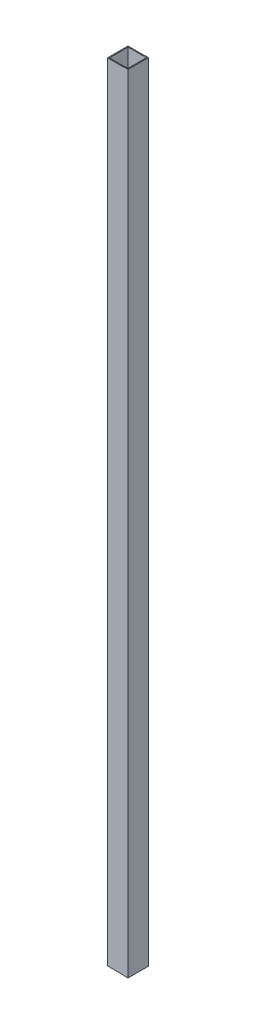
ISO-10303-21;
HEADER;
FILE_DESCRIPTION(('STEP AP214'),'2;1');
FILE_NAME('part.step','',(''),(''),'','','');
FILE_SCHEMA(('AUTOMOTIVE_DESIGN { 1 0 10303 214 1 1 1 1 }'));
ENDSEC;
DATA;
#1=APPLICATION_CONTEXT('core data for automotive mechanical design processes');
#2=APPLICATION_PROTOCOL_DEFINITION('international standard','automotive_design',2000,#1);
#3=PRODUCT_CONTEXT('',#1,'mechanical');
#4=PRODUCT('Part','Part','',(#3));
#5=PRODUCT_RELATED_PRODUCT_CATEGORY('part','',(#4));
#6=PRODUCT_DEFINITION_FORMATION('','',#4);
#7=PRODUCT_DEFINITION_CONTEXT('part definition',#1,'design');
#8=PRODUCT_DEFINITION('design','',#6,#7);
#9=PRODUCT_DEFINITION_SHAPE('','',#8);
#10=(LENGTH_UNIT() NAMED_UNIT(*) SI_UNIT(.MILLI.,.METRE.));
#11=(NAMED_UNIT(*) PLANE_ANGLE_UNIT() SI_UNIT($,.RADIAN.));
#12=(NAMED_UNIT(*) SI_UNIT($,.STERADIAN.) SOLID_ANGLE_UNIT());
#13=UNCERTAINTY_MEASURE_WITH_UNIT(LENGTH_MEASURE(1.E-05),#10,'distance_accuracy_value','');
#14=(GEOMETRIC_REPRESENTATION_CONTEXT(3) GLOBAL_UNCERTAINTY_ASSIGNED_CONTEXT((#13)) GLOBAL_UNIT_ASSIGNED_CONTEXT((#10,
#11,#12)) REPRESENTATION_CONTEXT('',''));
#15=CARTESIAN_POINT('',(0.,0.,0.));
#16=DIRECTION('',(0.,0.,1.));
#17=DIRECTION('',(1.,0.,0.));
#18=AXIS2_PLACEMENT_3D('',#15,#16,#17);
#19=CARTESIAN_POINT('',(0.,1923.,0.));
#20=DIRECTION('',(0.,-1.,0.));
#21=DIRECTION('',(0.,0.,-1.));
#22=AXIS2_PLACEMENT_3D('',#19,#20,#21);
#23=PLANE('',#22);
#24=DIRECTION('',(-1.,0.,0.));
#25=VECTOR('',#24,1.);
#26=CARTESIAN_POINT('',(0.,1923.,-50.));
#27=LINE('',#26,#25);
#28=CARTESIAN_POINT('',(50.,1923.,-50.));
#29=VERTEX_POINT('',#28);
#30=CARTESIAN_POINT('',(40.,1923.,-50.));
#31=VERTEX_POINT('',#30);
#32=EDGE_CURVE('E184',#29,#31,#27,.T.);
#33=ORIENTED_EDGE('',*,*,#32,.T.);
#34=DIRECTION('',(0.,0.,1.));
#35=VECTOR('',#34,1.);
#36=CARTESIAN_POINT('',(40.,1923.,-50.));
#37=LINE('',#36,#35);
#38=CARTESIAN_POINT('',(40.,1923.,-47.8));
#39=VERTEX_POINT('',#38);
#40=EDGE_CURVE('E257',#31,#39,#37,.T.);
#41=ORIENTED_EDGE('',*,*,#40,.T.);
#42=DIRECTION('',(-1.,0.,0.));
#43=VECTOR('',#42,1.);
#44=CARTESIAN_POINT('',(2.2,1923.,-47.8));
#45=LINE('',#44,#43);
#46=CARTESIAN_POINT('',(47.8,1923.,-47.8));
#47=VERTEX_POINT('',#46);
#48=EDGE_CURVE('E208',#47,#39,#45,.T.);
#49=ORIENTED_EDGE('',*,*,#48,.F.);
#50=DIRECTION('',(0.,0.,-1.));
#51=VECTOR('',#50,1.);
#52=CARTESIAN_POINT('',(47.8,1923.,-47.8));
#53=LINE('',#52,#51);
#54=CARTESIAN_POINT('',(47.8,1923.,-2.2));
#55=VERTEX_POINT('',#54);
#56=EDGE_CURVE('E213',#55,#47,#53,.T.);
#57=ORIENTED_EDGE('',*,*,#56,.F.);
#58=DIRECTION('',(1.,0.,0.));
#59=VECTOR('',#58,1.);
#60=CARTESIAN_POINT('',(47.8,1923.,-2.2));
#61=LINE('',#60,#59);
#62=CARTESIAN_POINT('',(40.,1923.,-2.2));
#63=VERTEX_POINT('',#62);
#64=EDGE_CURVE('E277',#63,#55,#61,.T.);
#65=ORIENTED_EDGE('',*,*,#64,.F.);
#66=CARTESIAN_POINT('',(40.,1923.,0.));
#67=VERTEX_POINT('',#66);
#68=EDGE_CURVE('E241',#63,#67,#37,.T.);
#69=ORIENTED_EDGE('',*,*,#68,.T.);
#70=DIRECTION('',(1.,0.,0.));
#71=VECTOR('',#70,1.);
#72=CARTESIAN_POINT('',(50.,1923.,0.));
#73=LINE('',#72,#71);
#74=CARTESIAN_POINT('',(50.,1923.,0.));
#75=VERTEX_POINT('',#74);
#76=EDGE_CURVE('E171',#67,#75,#73,.T.);
#77=ORIENTED_EDGE('',*,*,#76,.T.);
#78=DIRECTION('',(0.,0.,-1.));
#79=VECTOR('',#78,1.);
#80=CARTESIAN_POINT('',(50.,1923.,-50.));
#81=LINE('',#80,#79);
#82=EDGE_CURVE('E174',#75,#29,#81,.T.);
#83=ORIENTED_EDGE('',*,*,#82,.T.);
#84=EDGE_LOOP('',(#33,#41,#49,#57,#65,#69,#77,#83));
#85=FACE_BOUND('',#84,.T.);
#86=ADVANCED_FACE('F33',(#85),#23,.F.);
#87=CARTESIAN_POINT('',(0.,0.,0.));
#88=DIRECTION('',(0.,-1.,0.));
#89=DIRECTION('',(0.,0.,-1.));
#90=AXIS2_PLACEMENT_3D('',#87,#88,#89);
#91=PLANE('',#90);
#92=DIRECTION('',(0.,0.,1.));
#93=VECTOR('',#92,1.);
#94=CARTESIAN_POINT('',(40.,0.,-50.));
#95=LINE('',#94,#93);
#96=CARTESIAN_POINT('',(40.,0.,-50.));
#97=VERTEX_POINT('',#96);
#98=CARTESIAN_POINT('',(40.,0.,-47.8));
#99=VERTEX_POINT('',#98);
#100=EDGE_CURVE('E56',#97,#99,#95,.T.);
#101=ORIENTED_EDGE('',*,*,#100,.F.);
#102=DIRECTION('',(-1.,0.,0.));
#103=VECTOR('',#102,1.);
#104=CARTESIAN_POINT('',(0.,0.,-50.));
#105=LINE('',#104,#103);
#106=CARTESIAN_POINT('',(50.,0.,-50.));
#107=VERTEX_POINT('',#106);
#108=EDGE_CURVE('E159',#107,#97,#105,.T.);
#109=ORIENTED_EDGE('',*,*,#108,.F.);
#110=DIRECTION('',(0.,0.,-1.));
#111=VECTOR('',#110,1.);
#112=CARTESIAN_POINT('',(50.,0.,-50.));
#113=LINE('',#112,#111);
#114=CARTESIAN_POINT('',(50.,0.,0.));
#115=VERTEX_POINT('',#114);
#116=EDGE_CURVE('E172',#115,#107,#113,.T.);
#117=ORIENTED_EDGE('',*,*,#116,.F.);
#118=DIRECTION('',(1.,0.,0.));
#119=VECTOR('',#118,1.);
#120=CARTESIAN_POINT('',(50.,0.,0.));
#121=LINE('',#120,#119);
#122=CARTESIAN_POINT('',(40.,0.,0.));
#123=VERTEX_POINT('',#122);
#124=EDGE_CURVE('E176',#123,#115,#121,.T.);
#125=ORIENTED_EDGE('',*,*,#124,.F.);
#126=CARTESIAN_POINT('',(40.,0.,-2.2));
#127=VERTEX_POINT('',#126);
#128=EDGE_CURVE('E164',#127,#123,#95,.T.);
#129=ORIENTED_EDGE('',*,*,#128,.F.);
#130=DIRECTION('',(1.,0.,0.));
#131=VECTOR('',#130,1.);
#132=CARTESIAN_POINT('',(47.8,0.,-2.2));
#133=LINE('',#132,#131);
#134=CARTESIAN_POINT('',(47.8,0.,-2.2));
#135=VERTEX_POINT('',#134);
#136=EDGE_CURVE('E276',#127,#135,#133,.T.);
#137=ORIENTED_EDGE('',*,*,#136,.T.);
#138=DIRECTION('',(0.,0.,-1.));
#139=VECTOR('',#138,1.);
#140=CARTESIAN_POINT('',(47.8,0.,-47.8));
#141=LINE('',#140,#139);
#142=CARTESIAN_POINT('',(47.8,0.,-47.8));
#143=VERTEX_POINT('',#142);
#144=EDGE_CURVE('E281',#135,#143,#141,.T.);
#145=ORIENTED_EDGE('',*,*,#144,.T.);
#146=DIRECTION('',(-1.,0.,0.));
#147=VECTOR('',#146,1.);
#148=CARTESIAN_POINT('',(2.2,0.,-47.8));
#149=LINE('',#148,#147);
#150=EDGE_CURVE('E162',#143,#99,#149,.T.);
#151=ORIENTED_EDGE('',*,*,#150,.T.);
#152=EDGE_LOOP('',(#101,#109,#117,#125,#129,#137,#145,#151));
#153=FACE_BOUND('',#152,.T.);
#154=ADVANCED_FACE('F157',(#153),#91,.T.);
#155=CARTESIAN_POINT('',(50.,1923.,0.));
#156=DIRECTION('',(0.,0.,-1.));
#157=DIRECTION('',(-1.,0.,0.));
#158=AXIS2_PLACEMENT_3D('',#155,#156,#157);
#159=PLANE('',#158);
#160=DIRECTION('',(0.,-1.,0.));
#161=VECTOR('',#160,1.);
#162=CARTESIAN_POINT('',(0.,1923.,0.));
#163=LINE('',#162,#161);
#164=CARTESIAN_POINT('',(0.,1922.5,0.));
#165=VERTEX_POINT('',#164);
#166=CARTESIAN_POINT('',(0.,0.5,0.));
#167=VERTEX_POINT('',#166);
#168=EDGE_CURVE('E180',#165,#167,#163,.T.);
#169=ORIENTED_EDGE('',*,*,#168,.T.);
#170=DIRECTION('',(-1.,0.,0.));
#171=VECTOR('',#170,1.);
#172=CARTESIAN_POINT('',(0.,0.5,0.));
#173=LINE('',#172,#171);
#174=CARTESIAN_POINT('',(40.,0.5,0.));
#175=VERTEX_POINT('',#174);
#176=EDGE_CURVE('E152',#175,#167,#173,.T.);
#177=ORIENTED_EDGE('',*,*,#176,.F.);
#178=DIRECTION('',(0.,1.,0.));
#179=VECTOR('',#178,1.);
#180=CARTESIAN_POINT('',(40.,0.5,0.));
#181=LINE('',#180,#179);
#182=EDGE_CURVE('E232',#123,#175,#181,.T.);
#183=ORIENTED_EDGE('',*,*,#182,.F.);
#184=ORIENTED_EDGE('',*,*,#124,.T.);
#185=DIRECTION('',(0.,-1.,0.));
#186=VECTOR('',#185,1.);
#187=CARTESIAN_POINT('',(50.,1923.,0.));
#188=LINE('',#187,#186);
#189=EDGE_CURVE('E188',#75,#115,#188,.T.);
#190=ORIENTED_EDGE('',*,*,#189,.F.);
#191=ORIENTED_EDGE('',*,*,#76,.F.);
#192=DIRECTION('',(0.,1.,0.));
#193=VECTOR('',#192,1.);
#194=CARTESIAN_POINT('',(40.,1923.,0.));
#195=LINE('',#194,#193);
#196=CARTESIAN_POINT('',(40.,1922.5,0.));
#197=VERTEX_POINT('',#196);
#198=EDGE_CURVE('E244',#197,#67,#195,.T.);
#199=ORIENTED_EDGE('',*,*,#198,.F.);
#200=DIRECTION('',(1.,0.,0.));
#201=VECTOR('',#200,1.);
#202=CARTESIAN_POINT('',(40.,1922.5,0.));
#203=LINE('',#202,#201);
#204=EDGE_CURVE('E246',#165,#197,#203,.T.);
#205=ORIENTED_EDGE('',*,*,#204,.F.);
#206=EDGE_LOOP('',(#169,#177,#183,#184,#190,#191,#199,#205));
#207=FACE_BOUND('',#206,.T.);
#208=ADVANCED_FACE('F35',(#207),#159,.F.);
#209=CARTESIAN_POINT('',(50.,1923.,-50.));
#210=DIRECTION('',(-1.,0.,0.));
#211=DIRECTION('',(0.,0.,1.));
#212=AXIS2_PLACEMENT_3D('',#209,#210,#211);
#213=PLANE('',#212);
#214=ORIENTED_EDGE('',*,*,#116,.T.);
#215=DIRECTION('',(0.,-1.,0.));
#216=VECTOR('',#215,1.);
#217=CARTESIAN_POINT('',(50.,1923.,-50.));
#218=LINE('',#217,#216);
#219=EDGE_CURVE('E170',#29,#107,#218,.T.);
#220=ORIENTED_EDGE('',*,*,#219,.F.);
#221=ORIENTED_EDGE('',*,*,#82,.F.);
#222=ORIENTED_EDGE('',*,*,#189,.T.);
#223=EDGE_LOOP('',(#214,#220,#221,#222));
#224=FACE_BOUND('',#223,.T.);
#225=ADVANCED_FACE('F236',(#224),#213,.F.);
#226=CARTESIAN_POINT('',(0.,1923.,-50.));
#227=DIRECTION('',(0.,0.,1.));
#228=DIRECTION('',(1.,0.,0.));
#229=AXIS2_PLACEMENT_3D('',#226,#227,#228);
#230=PLANE('',#229);
#231=DIRECTION('',(0.,1.,0.));
#232=VECTOR('',#231,1.);
#233=CARTESIAN_POINT('',(40.,0.5,-50.));
#234=LINE('',#233,#232);
#235=CARTESIAN_POINT('',(40.,0.5,-50.));
#236=VERTEX_POINT('',#235);
#237=EDGE_CURVE('E143',#97,#236,#234,.T.);
#238=ORIENTED_EDGE('',*,*,#237,.T.);
#239=DIRECTION('',(-1.,0.,0.));
#240=VECTOR('',#239,1.);
#241=CARTESIAN_POINT('',(0.,0.5,-50.));
#242=LINE('',#241,#240);
#243=CARTESIAN_POINT('',(0.,0.5,-50.));
#244=VERTEX_POINT('',#243);
#245=EDGE_CURVE('E151',#236,#244,#242,.T.);
#246=ORIENTED_EDGE('',*,*,#245,.T.);
#247=DIRECTION('',(0.,-1.,0.));
#248=VECTOR('',#247,1.);
#249=CARTESIAN_POINT('',(0.,1923.,-50.));
#250=LINE('',#249,#248);
#251=CARTESIAN_POINT('',(0.,1922.5,-50.));
#252=VERTEX_POINT('',#251);
#253=EDGE_CURVE('E183',#252,#244,#250,.T.);
#254=ORIENTED_EDGE('',*,*,#253,.F.);
#255=DIRECTION('',(1.,0.,0.));
#256=VECTOR('',#255,1.);
#257=CARTESIAN_POINT('',(40.,1922.5,-50.));
#258=LINE('',#257,#256);
#259=CARTESIAN_POINT('',(40.,1922.5,-50.));
#260=VERTEX_POINT('',#259);
#261=EDGE_CURVE('E249',#252,#260,#258,.T.);
#262=ORIENTED_EDGE('',*,*,#261,.T.);
#263=DIRECTION('',(0.,1.,0.));
#264=VECTOR('',#263,1.);
#265=CARTESIAN_POINT('',(40.,1923.,-50.));
#266=LINE('',#265,#264);
#267=EDGE_CURVE('E252',#260,#31,#266,.T.);
#268=ORIENTED_EDGE('',*,*,#267,.T.);
#269=ORIENTED_EDGE('',*,*,#32,.F.);
#270=ORIENTED_EDGE('',*,*,#219,.T.);
#271=ORIENTED_EDGE('',*,*,#108,.T.);
#272=EDGE_LOOP('',(#238,#246,#254,#262,#268,#269,#270,#271));
#273=FACE_BOUND('',#272,.T.);
#274=ADVANCED_FACE('F167',(#273),#230,.F.);
#275=CARTESIAN_POINT('',(0.,1923.,0.));
#276=DIRECTION('',(1.,0.,0.));
#277=DIRECTION('',(0.,0.,-1.));
#278=AXIS2_PLACEMENT_3D('',#275,#276,#277);
#279=PLANE('',#278);
#280=ORIENTED_EDGE('',*,*,#253,.T.);
#281=DIRECTION('',(0.,0.,1.));
#282=VECTOR('',#281,1.);
#283=CARTESIAN_POINT('',(0.,0.5,-50.));
#284=LINE('',#283,#282);
#285=EDGE_CURVE('E199',#244,#167,#284,.T.);
#286=ORIENTED_EDGE('',*,*,#285,.T.);
#287=ORIENTED_EDGE('',*,*,#168,.F.);
#288=DIRECTION('',(0.,0.,1.));
#289=VECTOR('',#288,1.);
#290=CARTESIAN_POINT('',(0.,1922.5,-50.));
#291=LINE('',#290,#289);
#292=EDGE_CURVE('E263',#252,#165,#291,.T.);
#293=ORIENTED_EDGE('',*,*,#292,.F.);
#294=EDGE_LOOP('',(#280,#286,#287,#293));
#295=FACE_BOUND('',#294,.T.);
#296=ADVANCED_FACE('F314',(#295),#279,.F.);
#297=CARTESIAN_POINT('',(2.2,1923.,-2.2));
#298=DIRECTION('',(1.,0.,0.));
#299=DIRECTION('',(0.,0.,-1.));
#300=AXIS2_PLACEMENT_3D('',#297,#298,#299);
#301=PLANE('',#300);
#302=DIRECTION('',(0.,0.,1.));
#303=VECTOR('',#302,1.);
#304=CARTESIAN_POINT('',(2.2,0.499999999999945,-2.2));
#305=LINE('',#304,#303);
#306=CARTESIAN_POINT('',(2.2,0.499999999999945,-47.8));
#307=VERTEX_POINT('',#306);
#308=CARTESIAN_POINT('',(2.2,0.499999999999945,-2.2));
#309=VERTEX_POINT('',#308);
#310=EDGE_CURVE('E272',#307,#309,#305,.T.);
#311=ORIENTED_EDGE('',*,*,#310,.F.);
#312=DIRECTION('',(0.,-1.,0.));
#313=VECTOR('',#312,1.);
#314=CARTESIAN_POINT('',(2.2,1923.,-47.8));
#315=LINE('',#314,#313);
#316=CARTESIAN_POINT('',(2.2,1922.5,-47.8));
#317=VERTEX_POINT('',#316);
#318=EDGE_CURVE('E204',#317,#307,#315,.T.);
#319=ORIENTED_EDGE('',*,*,#318,.F.);
#320=DIRECTION('',(0.,0.,-1.));
#321=VECTOR('',#320,1.);
#322=CARTESIAN_POINT('',(2.2,1922.5,-2.2));
#323=LINE('',#322,#321);
#324=CARTESIAN_POINT('',(2.2,1922.5,-2.2));
#325=VERTEX_POINT('',#324);
#326=EDGE_CURVE('E48',#325,#317,#323,.T.);
#327=ORIENTED_EDGE('',*,*,#326,.F.);
#328=DIRECTION('',(0.,-1.,0.));
#329=VECTOR('',#328,1.);
#330=CARTESIAN_POINT('',(2.2,1923.,-2.2));
#331=LINE('',#330,#329);
#332=EDGE_CURVE('E220',#325,#309,#331,.T.);
#333=ORIENTED_EDGE('',*,*,#332,.T.);
#334=EDGE_LOOP('',(#311,#319,#327,#333));
#335=FACE_BOUND('',#334,.T.);
#336=ADVANCED_FACE('F315',(#335),#301,.T.);
#337=CARTESIAN_POINT('',(47.8,1923.,-2.2));
#338=DIRECTION('',(0.,0.,-1.));
#339=DIRECTION('',(-1.,0.,0.));
#340=AXIS2_PLACEMENT_3D('',#337,#338,#339);
#341=PLANE('',#340);
#342=DIRECTION('',(1.,0.,0.));
#343=VECTOR('',#342,1.);
#344=CARTESIAN_POINT('',(47.8,0.499999999999945,-2.2));
#345=LINE('',#344,#343);
#346=CARTESIAN_POINT('',(40.,0.5,-2.2));
#347=VERTEX_POINT('',#346);
#348=EDGE_CURVE('E274',#309,#347,#345,.T.);
#349=ORIENTED_EDGE('',*,*,#348,.F.);
#350=ORIENTED_EDGE('',*,*,#332,.F.);
#351=DIRECTION('',(-1.,0.,0.));
#352=VECTOR('',#351,1.);
#353=CARTESIAN_POINT('',(47.8,1922.5,-2.2));
#354=LINE('',#353,#352);
#355=CARTESIAN_POINT('',(40.,1922.5,-2.2));
#356=VERTEX_POINT('',#355);
#357=EDGE_CURVE('E266',#356,#325,#354,.T.);
#358=ORIENTED_EDGE('',*,*,#357,.F.);
#359=DIRECTION('',(0.,-1.,0.));
#360=VECTOR('',#359,1.);
#361=CARTESIAN_POINT('',(40.,1923.,-2.2));
#362=LINE('',#361,#360);
#363=EDGE_CURVE('E268',#63,#356,#362,.T.);
#364=ORIENTED_EDGE('',*,*,#363,.F.);
#365=ORIENTED_EDGE('',*,*,#64,.T.);
#366=DIRECTION('',(0.,-1.,0.));
#367=VECTOR('',#366,1.);
#368=CARTESIAN_POINT('',(47.8,1923.,-2.2));
#369=LINE('',#368,#367);
#370=EDGE_CURVE('E210',#55,#135,#369,.T.);
#371=ORIENTED_EDGE('',*,*,#370,.T.);
#372=ORIENTED_EDGE('',*,*,#136,.F.);
#373=DIRECTION('',(0.,-1.,0.));
#374=VECTOR('',#373,1.);
#375=CARTESIAN_POINT('',(39.9999999999733,1923.,-2.2));
#376=LINE('',#375,#374);
#377=EDGE_CURVE('E270',#347,#127,#376,.T.);
#378=ORIENTED_EDGE('',*,*,#377,.F.);
#379=EDGE_LOOP('',(#349,#350,#358,#364,#365,#371,#372,#378));
#380=FACE_BOUND('',#379,.T.);
#381=ADVANCED_FACE('F305',(#380),#341,.T.);
#382=CARTESIAN_POINT('',(47.8,1923.,-47.8));
#383=DIRECTION('',(-1.,0.,0.));
#384=DIRECTION('',(0.,0.,1.));
#385=AXIS2_PLACEMENT_3D('',#382,#383,#384);
#386=PLANE('',#385);
#387=ORIENTED_EDGE('',*,*,#144,.F.);
#388=ORIENTED_EDGE('',*,*,#370,.F.);
#389=ORIENTED_EDGE('',*,*,#56,.T.);
#390=DIRECTION('',(0.,-1.,0.));
#391=VECTOR('',#390,1.);
#392=CARTESIAN_POINT('',(47.8,1923.,-47.8));
#393=LINE('',#392,#391);
#394=EDGE_CURVE('E207',#47,#143,#393,.T.);
#395=ORIENTED_EDGE('',*,*,#394,.T.);
#396=EDGE_LOOP('',(#387,#388,#389,#395));
#397=FACE_BOUND('',#396,.T.);
#398=ADVANCED_FACE('F286',(#397),#386,.T.);
#399=CARTESIAN_POINT('',(2.2,1923.,-47.8));
#400=DIRECTION('',(0.,0.,1.));
#401=DIRECTION('',(1.,0.,0.));
#402=AXIS2_PLACEMENT_3D('',#399,#400,#401);
#403=PLANE('',#402);
#404=DIRECTION('',(-1.,0.,0.));
#405=VECTOR('',#404,1.);
#406=CARTESIAN_POINT('',(2.2,0.499999999999945,-47.8));
#407=LINE('',#406,#405);
#408=CARTESIAN_POINT('',(40.,0.5,-47.8));
#409=VERTEX_POINT('',#408);
#410=EDGE_CURVE('E11',#409,#307,#407,.T.);
#411=ORIENTED_EDGE('',*,*,#410,.F.);
#412=DIRECTION('',(0.,1.,0.));
#413=VECTOR('',#412,1.);
#414=CARTESIAN_POINT('',(39.9999999999733,1923.,-47.8));
#415=LINE('',#414,#413);
#416=EDGE_CURVE('E41',#99,#409,#415,.T.);
#417=ORIENTED_EDGE('',*,*,#416,.F.);
#418=ORIENTED_EDGE('',*,*,#150,.F.);
#419=ORIENTED_EDGE('',*,*,#394,.F.);
#420=ORIENTED_EDGE('',*,*,#48,.T.);
#421=DIRECTION('',(0.,1.,0.));
#422=VECTOR('',#421,1.);
#423=CARTESIAN_POINT('',(40.,1923.,-47.8));
#424=LINE('',#423,#422);
#425=CARTESIAN_POINT('',(40.,1922.5,-47.8));
#426=VERTEX_POINT('',#425);
#427=EDGE_CURVE('E193',#426,#39,#424,.T.);
#428=ORIENTED_EDGE('',*,*,#427,.F.);
#429=DIRECTION('',(1.,0.,0.));
#430=VECTOR('',#429,1.);
#431=CARTESIAN_POINT('',(2.2,1922.5,-47.8));
#432=LINE('',#431,#430);
#433=EDGE_CURVE('E191',#317,#426,#432,.T.);
#434=ORIENTED_EDGE('',*,*,#433,.F.);
#435=ORIENTED_EDGE('',*,*,#318,.T.);
#436=EDGE_LOOP('',(#411,#417,#418,#419,#420,#428,#434,#435));
#437=FACE_BOUND('',#436,.T.);
#438=ADVANCED_FACE('F202',(#437),#403,.T.);
#439=CARTESIAN_POINT('',(40.,1923.,-50.));
#440=DIRECTION('',(1.,0.,0.));
#441=DIRECTION('',(0.,0.,-1.));
#442=AXIS2_PLACEMENT_3D('',#439,#440,#441);
#443=PLANE('',#442);
#444=ORIENTED_EDGE('',*,*,#363,.T.);
#445=DIRECTION('',(0.,0.,1.));
#446=VECTOR('',#445,1.);
#447=CARTESIAN_POINT('',(40.,1922.5,-50.));
#448=LINE('',#447,#446);
#449=EDGE_CURVE('E262',#356,#197,#448,.T.);
#450=ORIENTED_EDGE('',*,*,#449,.T.);
#451=ORIENTED_EDGE('',*,*,#198,.T.);
#452=ORIENTED_EDGE('',*,*,#68,.F.);
#453=EDGE_LOOP('',(#444,#450,#451,#452));
#454=FACE_BOUND('',#453,.T.);
#455=ADVANCED_FACE('F310',(#454),#443,.F.);
#456=ORIENTED_EDGE('',*,*,#427,.T.);
#457=ORIENTED_EDGE('',*,*,#40,.F.);
#458=ORIENTED_EDGE('',*,*,#267,.F.);
#459=EDGE_CURVE('E259',#260,#426,#448,.T.);
#460=ORIENTED_EDGE('',*,*,#459,.T.);
#461=EDGE_LOOP('',(#456,#457,#458,#460));
#462=FACE_BOUND('',#461,.T.);
#463=ADVANCED_FACE('F292',(#462),#443,.F.);
#464=CARTESIAN_POINT('',(40.,1922.5,-50.));
#465=DIRECTION('',(0.,-1.,0.));
#466=DIRECTION('',(0.,0.,-1.));
#467=AXIS2_PLACEMENT_3D('',#464,#465,#466);
#468=PLANE('',#467);
#469=ORIENTED_EDGE('',*,*,#357,.T.);
#470=ORIENTED_EDGE('',*,*,#326,.T.);
#471=ORIENTED_EDGE('',*,*,#433,.T.);
#472=ORIENTED_EDGE('',*,*,#459,.F.);
#473=ORIENTED_EDGE('',*,*,#261,.F.);
#474=ORIENTED_EDGE('',*,*,#292,.T.);
#475=ORIENTED_EDGE('',*,*,#204,.T.);
#476=ORIENTED_EDGE('',*,*,#449,.F.);
#477=EDGE_LOOP('',(#469,#470,#471,#472,#473,#474,#475,#476));
#478=FACE_BOUND('',#477,.T.);
#479=ADVANCED_FACE('F311',(#478),#468,.F.);
#480=CARTESIAN_POINT('',(40.,0.5,-50.));
#481=DIRECTION('',(1.,0.,0.));
#482=DIRECTION('',(0.,1.,0.));
#483=AXIS2_PLACEMENT_3D('',#480,#481,#482);
#484=PLANE('',#483);
#485=ORIENTED_EDGE('',*,*,#377,.T.);
#486=ORIENTED_EDGE('',*,*,#128,.T.);
#487=ORIENTED_EDGE('',*,*,#182,.T.);
#488=DIRECTION('',(0.,0.,1.));
#489=VECTOR('',#488,1.);
#490=CARTESIAN_POINT('',(40.,0.5,-50.));
#491=LINE('',#490,#489);
#492=EDGE_CURVE('E163',#347,#175,#491,.T.);
#493=ORIENTED_EDGE('',*,*,#492,.F.);
#494=EDGE_LOOP('',(#485,#486,#487,#493));
#495=FACE_BOUND('',#494,.T.);
#496=ADVANCED_FACE('F300',(#495),#484,.F.);
#497=CARTESIAN_POINT('',(0.,0.5,-50.));
#498=DIRECTION('',(0.,1.,0.));
#499=DIRECTION('',(0.,0.,1.));
#500=AXIS2_PLACEMENT_3D('',#497,#498,#499);
#501=PLANE('',#500);
#502=ORIENTED_EDGE('',*,*,#348,.T.);
#503=ORIENTED_EDGE('',*,*,#492,.T.);
#504=ORIENTED_EDGE('',*,*,#176,.T.);
#505=ORIENTED_EDGE('',*,*,#285,.F.);
#506=ORIENTED_EDGE('',*,*,#245,.F.);
#507=EDGE_CURVE('E146',#236,#409,#491,.T.);
#508=ORIENTED_EDGE('',*,*,#507,.T.);
#509=ORIENTED_EDGE('',*,*,#410,.T.);
#510=ORIENTED_EDGE('',*,*,#310,.T.);
#511=EDGE_LOOP('',(#502,#503,#504,#505,#506,#508,#509,#510));
#512=FACE_BOUND('',#511,.T.);
#513=ADVANCED_FACE('F197',(#512),#501,.F.);
#514=ORIENTED_EDGE('',*,*,#416,.T.);
#515=ORIENTED_EDGE('',*,*,#507,.F.);
#516=ORIENTED_EDGE('',*,*,#237,.F.);
#517=ORIENTED_EDGE('',*,*,#100,.T.);
#518=EDGE_LOOP('',(#514,#515,#516,#517));
#519=FACE_BOUND('',#518,.T.);
#520=ADVANCED_FACE('F144',(#519),#484,.F.);
#521=CLOSED_SHELL('',(#86,#154,#208,#225,#274,#296,#336,#381,#398,#438,#455,#463,#479,#496,#513,#520));
#522=MANIFOLD_SOLID_BREP('B2',#521);
#523=ADVANCED_BREP_SHAPE_REPRESENTATION('',(#18,#522),#14);
#524=SHAPE_DEFINITION_REPRESENTATION(#9,#523);
ENDSEC;
END-ISO-10303-21;
